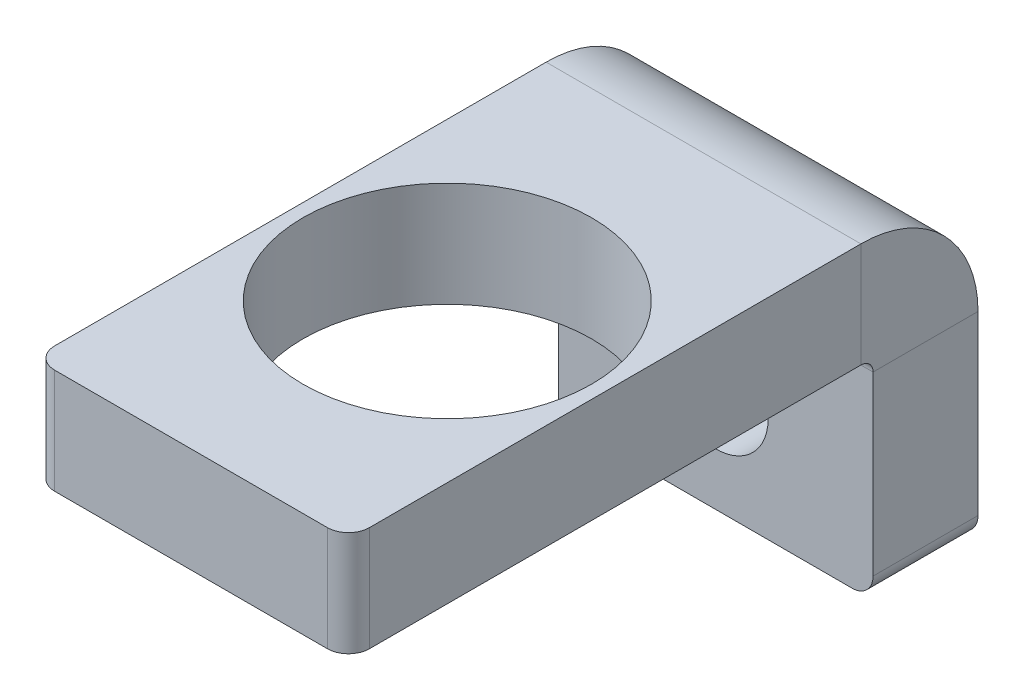
ISO-10303-21;
HEADER;
FILE_DESCRIPTION(('STEP AP214'),'2;1');
FILE_NAME('part.step','',(''),(''),'','','');
FILE_SCHEMA(('AUTOMOTIVE_DESIGN { 1 0 10303 214 1 1 1 1 }'));
ENDSEC;
DATA;
#1=APPLICATION_CONTEXT('core data for automotive mechanical design processes');
#2=APPLICATION_PROTOCOL_DEFINITION('international standard','automotive_design',2000,#1);
#3=PRODUCT_CONTEXT('',#1,'mechanical');
#4=PRODUCT('Part','Part','',(#3));
#5=PRODUCT_RELATED_PRODUCT_CATEGORY('part','',(#4));
#6=PRODUCT_DEFINITION_FORMATION('','',#4);
#7=PRODUCT_DEFINITION_CONTEXT('part definition',#1,'design');
#8=PRODUCT_DEFINITION('design','',#6,#7);
#9=PRODUCT_DEFINITION_SHAPE('','',#8);
#10=(LENGTH_UNIT() NAMED_UNIT(*) SI_UNIT(.MILLI.,.METRE.));
#11=(NAMED_UNIT(*) PLANE_ANGLE_UNIT() SI_UNIT($,.RADIAN.));
#12=(NAMED_UNIT(*) SI_UNIT($,.STERADIAN.) SOLID_ANGLE_UNIT());
#13=UNCERTAINTY_MEASURE_WITH_UNIT(LENGTH_MEASURE(1.E-05),#10,'distance_accuracy_value','');
#14=(GEOMETRIC_REPRESENTATION_CONTEXT(3) GLOBAL_UNCERTAINTY_ASSIGNED_CONTEXT((#13)) GLOBAL_UNIT_ASSIGNED_CONTEXT((#10,
#11,#12)) REPRESENTATION_CONTEXT('',''));
#15=CARTESIAN_POINT('',(0.,0.,0.));
#16=DIRECTION('',(0.,0.,1.));
#17=DIRECTION('',(1.,0.,0.));
#18=AXIS2_PLACEMENT_3D('',#15,#16,#17);
#19=CARTESIAN_POINT('',(-9.525,-9.525,-6.35));
#20=DIRECTION('',(-1.,0.,0.));
#21=DIRECTION('',(0.,0.,1.));
#22=AXIS2_PLACEMENT_3D('',#19,#20,#21);
#23=PLANE('',#22);
#24=DIRECTION('',(0.,-1.,0.));
#25=VECTOR('',#24,1.);
#26=CARTESIAN_POINT('',(-9.525,-9.525,-6.35));
#27=LINE('',#26,#25);
#28=CARTESIAN_POINT('',(-9.525,2.4384,-6.35));
#29=VERTEX_POINT('',#28);
#30=CARTESIAN_POINT('',(-9.525,-8.255,-6.35));
#31=VERTEX_POINT('',#30);
#32=EDGE_CURVE('E232',#29,#31,#27,.T.);
#33=ORIENTED_EDGE('',*,*,#32,.T.);
#34=DIRECTION('',(0.,0.,1.));
#35=VECTOR('',#34,1.);
#36=CARTESIAN_POINT('',(-9.525,-8.255,-6.35));
#37=LINE('',#36,#35);
#38=CARTESIAN_POINT('',(-9.525,-8.255,0.));
#39=VERTEX_POINT('',#38);
#40=EDGE_CURVE('E261',#31,#39,#37,.T.);
#41=ORIENTED_EDGE('',*,*,#40,.T.);
#42=DIRECTION('',(0.,-1.,0.));
#43=VECTOR('',#42,1.);
#44=CARTESIAN_POINT('',(-9.525,-9.525,0.));
#45=LINE('',#44,#43);
#46=CARTESIAN_POINT('',(-9.525,2.4384,0.));
#47=VERTEX_POINT('',#46);
#48=EDGE_CURVE('E240',#47,#39,#45,.T.);
#49=ORIENTED_EDGE('',*,*,#48,.F.);
#50=DIRECTION('',(0.,0.,-1.));
#51=VECTOR('',#50,1.);
#52=CARTESIAN_POINT('',(-9.525,2.4384,0.));
#53=LINE('',#52,#51);
#54=EDGE_CURVE('E211',#47,#29,#53,.T.);
#55=ORIENTED_EDGE('',*,*,#54,.T.);
#56=EDGE_LOOP('',(#33,#41,#49,#55));
#57=FACE_BOUND('',#56,.T.);
#58=ADVANCED_FACE('F65',(#57),#23,.T.);
#59=CARTESIAN_POINT('',(0.,0.,-6.35));
#60=DIRECTION('',(0.,0.,-1.));
#61=DIRECTION('',(-1.,0.,0.));
#62=AXIS2_PLACEMENT_3D('',#59,#60,#61);
#63=PLANE('',#62);
#64=CARTESIAN_POINT('',(0.,-3.175,-6.35));
#65=DIRECTION('',(0.,0.,1.));
#66=DIRECTION('',(1.,0.,0.));
#67=AXIS2_PLACEMENT_3D('',#64,#65,#66);
#68=CIRCLE('',#67,3.175);
#69=CARTESIAN_POINT('',(3.175,-3.175,-6.35));
#70=VERTEX_POINT('',#69);
#71=EDGE_CURVE('E224',#70,#70,#68,.T.);
#72=ORIENTED_EDGE('',*,*,#71,.T.);
#73=EDGE_LOOP('',(#72));
#74=FACE_BOUND('',#73,.T.);
#75=DIRECTION('',(1.,0.,0.));
#76=VECTOR('',#75,1.);
#77=CARTESIAN_POINT('',(-9.525,-9.525,-6.35));
#78=LINE('',#77,#76);
#79=CARTESIAN_POINT('',(-8.255,-9.525,-6.35));
#80=VERTEX_POINT('',#79);
#81=CARTESIAN_POINT('',(8.255,-9.525,-6.35));
#82=VERTEX_POINT('',#81);
#83=EDGE_CURVE('E236',#80,#82,#78,.T.);
#84=ORIENTED_EDGE('',*,*,#83,.F.);
#85=CARTESIAN_POINT('',(-8.255,-8.255,-6.35));
#86=DIRECTION('',(0.,0.,-1.));
#87=DIRECTION('',(-1.,0.,0.));
#88=AXIS2_PLACEMENT_3D('',#85,#86,#87);
#89=CIRCLE('',#88,1.27);
#90=EDGE_CURVE('E73',#80,#31,#89,.T.);
#91=ORIENTED_EDGE('',*,*,#90,.T.);
#92=ORIENTED_EDGE('',*,*,#32,.F.);
#93=DIRECTION('',(-1.,0.,0.));
#94=VECTOR('',#93,1.);
#95=CARTESIAN_POINT('',(-9.525,2.4384,-6.35));
#96=LINE('',#95,#94);
#97=CARTESIAN_POINT('',(9.525,2.4384,-6.35));
#98=VERTEX_POINT('',#97);
#99=EDGE_CURVE('E162',#29,#98,#96,.F.);
#100=ORIENTED_EDGE('',*,*,#99,.T.);
#101=DIRECTION('',(0.,1.,0.));
#102=VECTOR('',#101,1.);
#103=CARTESIAN_POINT('',(9.525,-9.525,-6.35));
#104=LINE('',#103,#102);
#105=CARTESIAN_POINT('',(9.525,-8.255,-6.35));
#106=VERTEX_POINT('',#105);
#107=EDGE_CURVE('E230',#106,#98,#104,.T.);
#108=ORIENTED_EDGE('',*,*,#107,.F.);
#109=CARTESIAN_POINT('',(8.255,-8.255,-6.35));
#110=DIRECTION('',(0.,0.,-1.));
#111=DIRECTION('',(-1.,0.,0.));
#112=AXIS2_PLACEMENT_3D('',#109,#110,#111);
#113=CIRCLE('',#112,1.27);
#114=EDGE_CURVE('E85',#106,#82,#113,.T.);
#115=ORIENTED_EDGE('',*,*,#114,.T.);
#116=EDGE_LOOP('',(#84,#91,#92,#100,#108,#115));
#117=FACE_BOUND('',#116,.T.);
#118=ADVANCED_FACE('F275',(#74,#117),#63,.T.);
#119=CARTESIAN_POINT('',(0.,0.,0.));
#120=DIRECTION('',(0.,0.,-1.));
#121=DIRECTION('',(-1.,0.,0.));
#122=AXIS2_PLACEMENT_3D('',#119,#120,#121);
#123=PLANE('',#122);
#124=CARTESIAN_POINT('',(0.,-3.175,0.));
#125=DIRECTION('',(0.,0.,1.));
#126=DIRECTION('',(1.,0.,0.));
#127=AXIS2_PLACEMENT_3D('',#124,#125,#126);
#128=CIRCLE('',#127,3.175);
#129=CARTESIAN_POINT('',(3.175,-3.175,0.));
#130=VERTEX_POINT('',#129);
#131=EDGE_CURVE('E222',#130,#130,#128,.T.);
#132=ORIENTED_EDGE('',*,*,#131,.F.);
#133=EDGE_LOOP('',(#132));
#134=FACE_BOUND('',#133,.T.);
#135=ORIENTED_EDGE('',*,*,#48,.T.);
#136=CARTESIAN_POINT('',(-8.255,-8.255,0.));
#137=DIRECTION('',(0.,0.,-1.));
#138=DIRECTION('',(-1.,0.,0.));
#139=AXIS2_PLACEMENT_3D('',#136,#137,#138);
#140=CIRCLE('',#139,1.27);
#141=CARTESIAN_POINT('',(-8.255,-9.525,0.));
#142=VERTEX_POINT('',#141);
#143=EDGE_CURVE('E266',#39,#142,#140,.F.);
#144=ORIENTED_EDGE('',*,*,#143,.T.);
#145=DIRECTION('',(1.,0.,0.));
#146=VECTOR('',#145,1.);
#147=CARTESIAN_POINT('',(-9.525,-9.525,0.));
#148=LINE('',#147,#146);
#149=CARTESIAN_POINT('',(8.255,-9.525,0.));
#150=VERTEX_POINT('',#149);
#151=EDGE_CURVE('E233',#142,#150,#148,.T.);
#152=ORIENTED_EDGE('',*,*,#151,.T.);
#153=CARTESIAN_POINT('',(8.255,-8.255,0.));
#154=DIRECTION('',(0.,0.,-1.));
#155=DIRECTION('',(-1.,0.,0.));
#156=AXIS2_PLACEMENT_3D('',#153,#154,#155);
#157=CIRCLE('',#156,1.27);
#158=CARTESIAN_POINT('',(9.525,-8.255,0.));
#159=VERTEX_POINT('',#158);
#160=EDGE_CURVE('E264',#150,#159,#157,.F.);
#161=ORIENTED_EDGE('',*,*,#160,.T.);
#162=DIRECTION('',(0.,1.,0.));
#163=VECTOR('',#162,1.);
#164=CARTESIAN_POINT('',(9.525,-9.525,0.));
#165=LINE('',#164,#163);
#166=CARTESIAN_POINT('',(9.525,2.4384,0.));
#167=VERTEX_POINT('',#166);
#168=EDGE_CURVE('E227',#159,#167,#165,.T.);
#169=ORIENTED_EDGE('',*,*,#168,.T.);
#170=DIRECTION('',(-1.,0.,0.));
#171=VECTOR('',#170,1.);
#172=CARTESIAN_POINT('',(-9.525,2.4384,0.));
#173=LINE('',#172,#171);
#174=EDGE_CURVE('E215',#47,#167,#173,.F.);
#175=ORIENTED_EDGE('',*,*,#174,.F.);
#176=EDGE_LOOP('',(#135,#144,#152,#161,#169,#175));
#177=FACE_BOUND('',#176,.T.);
#178=ADVANCED_FACE('F284',(#134,#177),#123,.F.);
#179=CARTESIAN_POINT('',(9.525,-9.525,-6.35));
#180=DIRECTION('',(1.,0.,0.));
#181=DIRECTION('',(0.,1.,0.));
#182=AXIS2_PLACEMENT_3D('',#179,#180,#181);
#183=PLANE('',#182);
#184=ORIENTED_EDGE('',*,*,#168,.F.);
#185=DIRECTION('',(0.,0.,1.));
#186=VECTOR('',#185,1.);
#187=CARTESIAN_POINT('',(9.525,-8.255,-6.35));
#188=LINE('',#187,#186);
#189=EDGE_CURVE('E13',#159,#106,#188,.F.);
#190=ORIENTED_EDGE('',*,*,#189,.T.);
#191=ORIENTED_EDGE('',*,*,#107,.T.);
#192=DIRECTION('',(0.,0.,-1.));
#193=VECTOR('',#192,1.);
#194=CARTESIAN_POINT('',(9.525,2.4384,0.));
#195=LINE('',#194,#193);
#196=EDGE_CURVE('E219',#167,#98,#195,.T.);
#197=ORIENTED_EDGE('',*,*,#196,.F.);
#198=EDGE_LOOP('',(#184,#190,#191,#197));
#199=FACE_BOUND('',#198,.T.);
#200=ADVANCED_FACE('F291',(#199),#183,.T.);
#201=CARTESIAN_POINT('',(-9.525,-9.525,-6.35));
#202=DIRECTION('',(0.,-1.,0.));
#203=DIRECTION('',(1.,0.,0.));
#204=AXIS2_PLACEMENT_3D('',#201,#202,#203);
#205=PLANE('',#204);
#206=ORIENTED_EDGE('',*,*,#151,.F.);
#207=DIRECTION('',(0.,0.,1.));
#208=VECTOR('',#207,1.);
#209=CARTESIAN_POINT('',(-8.255,-9.525,-6.35));
#210=LINE('',#209,#208);
#211=EDGE_CURVE('E271',#142,#80,#210,.F.);
#212=ORIENTED_EDGE('',*,*,#211,.T.);
#213=ORIENTED_EDGE('',*,*,#83,.T.);
#214=DIRECTION('',(0.,0.,1.));
#215=VECTOR('',#214,1.);
#216=CARTESIAN_POINT('',(8.255,-9.525,-6.35));
#217=LINE('',#216,#215);
#218=EDGE_CURVE('E268',#82,#150,#217,.T.);
#219=ORIENTED_EDGE('',*,*,#218,.T.);
#220=EDGE_LOOP('',(#206,#212,#213,#219));
#221=FACE_BOUND('',#220,.T.);
#222=ADVANCED_FACE('F287',(#221),#205,.T.);
#223=CARTESIAN_POINT('',(0.,-3.175,-6.35));
#224=DIRECTION('',(0.,0.,1.));
#225=DIRECTION('',(1.,0.,0.));
#226=AXIS2_PLACEMENT_3D('',#223,#224,#225);
#227=CYLINDRICAL_SURFACE('',#226,3.175);
#228=ORIENTED_EDGE('',*,*,#71,.F.);
#229=EDGE_LOOP('',(#228));
#230=FACE_BOUND('',#229,.T.);
#231=ORIENTED_EDGE('',*,*,#131,.T.);
#232=EDGE_LOOP('',(#231));
#233=FACE_BOUND('',#232,.T.);
#234=ADVANCED_FACE('F449',(#230,#233),#227,.F.);
#235=CARTESIAN_POINT('',(9.525,2.4384,0.7366));
#236=DIRECTION('',(1.,0.,0.));
#237=DIRECTION('',(0.,0.,-1.));
#238=AXIS2_PLACEMENT_3D('',#235,#236,#237);
#239=PLANE('',#238);
#240=DIRECTION('',(0.,-1.,0.));
#241=VECTOR('',#240,1.);
#242=CARTESIAN_POINT('',(9.525,9.525,0.736599999999975));
#243=LINE('',#242,#241);
#244=CARTESIAN_POINT('',(9.525,3.175,0.736599999999997));
#245=VERTEX_POINT('',#244);
#246=CARTESIAN_POINT('',(9.525,9.525,0.736599999999974));
#247=VERTEX_POINT('',#246);
#248=EDGE_CURVE('E205',#245,#247,#243,.F.);
#249=ORIENTED_EDGE('',*,*,#248,.F.);
#250=CARTESIAN_POINT('',(9.525,2.4384,0.7366));
#251=DIRECTION('',(-1.,0.,0.));
#252=DIRECTION('',(0.,0.,1.));
#253=AXIS2_PLACEMENT_3D('',#250,#251,#252);
#254=CIRCLE('',#253,0.7366);
#255=EDGE_CURVE('E165',#167,#245,#254,.F.);
#256=ORIENTED_EDGE('',*,*,#255,.F.);
#257=ORIENTED_EDGE('',*,*,#196,.T.);
#258=CARTESIAN_POINT('',(9.525,2.4384,0.7366));
#259=DIRECTION('',(-1.,0.,0.));
#260=DIRECTION('',(0.,0.,1.));
#261=AXIS2_PLACEMENT_3D('',#258,#259,#260);
#262=CIRCLE('',#261,7.0866);
#263=EDGE_CURVE('E210',#98,#247,#262,.F.);
#264=ORIENTED_EDGE('',*,*,#263,.T.);
#265=EDGE_LOOP('',(#249,#256,#257,#264));
#266=FACE_BOUND('',#265,.T.);
#267=ADVANCED_FACE('F295',(#266),#239,.T.);
#268=CARTESIAN_POINT('',(-9.525,2.4384,0.7366));
#269=DIRECTION('',(1.,0.,0.));
#270=DIRECTION('',(0.,0.,-1.));
#271=AXIS2_PLACEMENT_3D('',#268,#269,#270);
#272=PLANE('',#271);
#273=CARTESIAN_POINT('',(-9.525,2.4384,0.7366));
#274=DIRECTION('',(-1.,0.,0.));
#275=DIRECTION('',(0.,0.,1.));
#276=AXIS2_PLACEMENT_3D('',#273,#274,#275);
#277=CIRCLE('',#276,0.7366);
#278=CARTESIAN_POINT('',(-9.525,3.175,0.736599999999997));
#279=VERTEX_POINT('',#278);
#280=EDGE_CURVE('E172',#279,#47,#277,.T.);
#281=ORIENTED_EDGE('',*,*,#280,.F.);
#282=DIRECTION('',(0.,-1.,0.));
#283=VECTOR('',#282,1.);
#284=CARTESIAN_POINT('',(-9.525,3.175,0.736599999999997));
#285=LINE('',#284,#283);
#286=CARTESIAN_POINT('',(-9.525,9.525,0.736599999999975));
#287=VERTEX_POINT('',#286);
#288=EDGE_CURVE('E169',#279,#287,#285,.F.);
#289=ORIENTED_EDGE('',*,*,#288,.T.);
#290=CARTESIAN_POINT('',(-9.525,2.4384,0.7366));
#291=DIRECTION('',(-1.,0.,0.));
#292=DIRECTION('',(0.,0.,1.));
#293=AXIS2_PLACEMENT_3D('',#290,#291,#292);
#294=CIRCLE('',#293,7.0866);
#295=EDGE_CURVE('E154',#287,#29,#294,.T.);
#296=ORIENTED_EDGE('',*,*,#295,.T.);
#297=ORIENTED_EDGE('',*,*,#54,.F.);
#298=EDGE_LOOP('',(#281,#289,#296,#297));
#299=FACE_BOUND('',#298,.T.);
#300=ADVANCED_FACE('F170',(#299),#272,.F.);
#301=CARTESIAN_POINT('',(-9.525,2.4384,0.7366));
#302=DIRECTION('',(-1.,0.,0.));
#303=DIRECTION('',(0.,1.,0.));
#304=AXIS2_PLACEMENT_3D('',#301,#302,#303);
#305=CYLINDRICAL_SURFACE('',#304,7.0866);
#306=ORIENTED_EDGE('',*,*,#99,.F.);
#307=ORIENTED_EDGE('',*,*,#295,.F.);
#308=DIRECTION('',(-1.,0.,0.));
#309=VECTOR('',#308,1.);
#310=CARTESIAN_POINT('',(9.525,9.525,0.736599999999975));
#311=LINE('',#310,#309);
#312=EDGE_CURVE('E159',#287,#247,#311,.F.);
#313=ORIENTED_EDGE('',*,*,#312,.T.);
#314=ORIENTED_EDGE('',*,*,#263,.F.);
#315=EDGE_LOOP('',(#306,#307,#313,#314));
#316=FACE_BOUND('',#315,.T.);
#317=ADVANCED_FACE('F156',(#316),#305,.T.);
#318=CARTESIAN_POINT('',(-9.525,2.4384,0.7366));
#319=DIRECTION('',(-1.,0.,0.));
#320=DIRECTION('',(0.,1.,0.));
#321=AXIS2_PLACEMENT_3D('',#318,#319,#320);
#322=CYLINDRICAL_SURFACE('',#321,0.7366);
#323=ORIENTED_EDGE('',*,*,#174,.T.);
#324=ORIENTED_EDGE('',*,*,#255,.T.);
#325=DIRECTION('',(-1.,0.,0.));
#326=VECTOR('',#325,1.);
#327=CARTESIAN_POINT('',(9.525,3.175,0.736599999999997));
#328=LINE('',#327,#326);
#329=EDGE_CURVE('E177',#245,#279,#328,.T.);
#330=ORIENTED_EDGE('',*,*,#329,.T.);
#331=ORIENTED_EDGE('',*,*,#280,.T.);
#332=EDGE_LOOP('',(#323,#324,#330,#331));
#333=FACE_BOUND('',#332,.T.);
#334=ADVANCED_FACE('F298',(#333),#322,.F.);
#335=CARTESIAN_POINT('',(9.525,9.525,0.));
#336=DIRECTION('',(-1.,0.,0.));
#337=DIRECTION('',(0.,0.,1.));
#338=AXIS2_PLACEMENT_3D('',#335,#336,#337);
#339=PLANE('',#338);
#340=DIRECTION('',(0.,0.,-1.));
#341=VECTOR('',#340,1.);
#342=CARTESIAN_POINT('',(9.525,9.525,0.));
#343=LINE('',#342,#341);
#344=CARTESIAN_POINT('',(9.525,9.52500000000011,30.48));
#345=VERTEX_POINT('',#344);
#346=EDGE_CURVE('E186',#345,#247,#343,.T.);
#347=ORIENTED_EDGE('',*,*,#346,.F.);
#348=DIRECTION('',(0.,-1.,0.));
#349=VECTOR('',#348,1.);
#350=CARTESIAN_POINT('',(9.525,9.52500000000011,30.48));
#351=LINE('',#350,#349);
#352=CARTESIAN_POINT('',(9.525,3.17500000000011,30.48));
#353=VERTEX_POINT('',#352);
#354=EDGE_CURVE('E238',#345,#353,#351,.T.);
#355=ORIENTED_EDGE('',*,*,#354,.T.);
#356=DIRECTION('',(0.,0.,1.));
#357=VECTOR('',#356,1.);
#358=CARTESIAN_POINT('',(9.525,3.175,0.));
#359=LINE('',#358,#357);
#360=EDGE_CURVE('E187',#353,#245,#359,.F.);
#361=ORIENTED_EDGE('',*,*,#360,.T.);
#362=ORIENTED_EDGE('',*,*,#248,.T.);
#363=EDGE_LOOP('',(#347,#355,#361,#362));
#364=FACE_BOUND('',#363,.T.);
#365=ADVANCED_FACE('F315',(#364),#339,.F.);
#366=CARTESIAN_POINT('',(-9.525,9.52500000000011,31.75));
#367=DIRECTION('',(1.,0.,0.));
#368=DIRECTION('',(0.,0.,-1.));
#369=AXIS2_PLACEMENT_3D('',#366,#367,#368);
#370=PLANE('',#369);
#371=DIRECTION('',(0.,0.,-1.));
#372=VECTOR('',#371,1.);
#373=CARTESIAN_POINT('',(-9.525,3.17500000000011,31.75));
#374=LINE('',#373,#372);
#375=CARTESIAN_POINT('',(-9.525,3.17500000000011,30.48));
#376=VERTEX_POINT('',#375);
#377=EDGE_CURVE('E201',#279,#376,#374,.F.);
#378=ORIENTED_EDGE('',*,*,#377,.T.);
#379=DIRECTION('',(0.,-1.,0.));
#380=VECTOR('',#379,1.);
#381=CARTESIAN_POINT('',(-9.525,9.52500000000011,30.48));
#382=LINE('',#381,#380);
#383=CARTESIAN_POINT('',(-9.525,9.52500000000011,30.48));
#384=VERTEX_POINT('',#383);
#385=EDGE_CURVE('E191',#376,#384,#382,.F.);
#386=ORIENTED_EDGE('',*,*,#385,.T.);
#387=DIRECTION('',(0.,0.,1.));
#388=VECTOR('',#387,1.);
#389=CARTESIAN_POINT('',(-9.525,9.525,0.));
#390=LINE('',#389,#388);
#391=EDGE_CURVE('E183',#287,#384,#390,.T.);
#392=ORIENTED_EDGE('',*,*,#391,.F.);
#393=ORIENTED_EDGE('',*,*,#288,.F.);
#394=EDGE_LOOP('',(#378,#386,#392,#393));
#395=FACE_BOUND('',#394,.T.);
#396=ADVANCED_FACE('F189',(#395),#370,.F.);
#397=CARTESIAN_POINT('',(0.,9.525,0.));
#398=DIRECTION('',(0.,-1.,0.));
#399=DIRECTION('',(0.,0.,-1.));
#400=AXIS2_PLACEMENT_3D('',#397,#398,#399);
#401=PLANE('',#400);
#402=CARTESIAN_POINT('',(0.,9.52500000000019,16.2433));
#403=DIRECTION('',(0.,-1.,0.));
#404=DIRECTION('',(0.,0.,-1.));
#405=AXIS2_PLACEMENT_3D('',#402,#403,#404);
#406=CIRCLE('',#405,8.73125);
#407=CARTESIAN_POINT('',(0.,9.52500000000016,7.51205000000002));
#408=VERTEX_POINT('',#407);
#409=EDGE_CURVE('E208',#408,#408,#406,.T.);
#410=ORIENTED_EDGE('',*,*,#409,.T.);
#411=EDGE_LOOP('',(#410));
#412=FACE_BOUND('',#411,.T.);
#413=DIRECTION('',(1.,0.,0.));
#414=VECTOR('',#413,1.);
#415=CARTESIAN_POINT('',(0.,9.52500000000011,31.75));
#416=LINE('',#415,#414);
#417=CARTESIAN_POINT('',(-8.255,9.52500000000011,31.75));
#418=VERTEX_POINT('',#417);
#419=CARTESIAN_POINT('',(8.255,9.52500000000011,31.75));
#420=VERTEX_POINT('',#419);
#421=EDGE_CURVE('E192',#418,#420,#416,.T.);
#422=ORIENTED_EDGE('',*,*,#421,.T.);
#423=CARTESIAN_POINT('',(8.255,9.52500000000011,30.48));
#424=DIRECTION('',(0.,-1.,0.));
#425=DIRECTION('',(0.,0.,-1.));
#426=AXIS2_PLACEMENT_3D('',#423,#424,#425);
#427=CIRCLE('',#426,1.27);
#428=EDGE_CURVE('E258',#420,#345,#427,.F.);
#429=ORIENTED_EDGE('',*,*,#428,.T.);
#430=ORIENTED_EDGE('',*,*,#346,.T.);
#431=ORIENTED_EDGE('',*,*,#312,.F.);
#432=ORIENTED_EDGE('',*,*,#391,.T.);
#433=CARTESIAN_POINT('',(-8.255,9.52500000000011,30.48));
#434=DIRECTION('',(0.,-1.,0.));
#435=DIRECTION('',(0.,0.,-1.));
#436=AXIS2_PLACEMENT_3D('',#433,#434,#435);
#437=CIRCLE('',#436,1.27);
#438=EDGE_CURVE('E256',#384,#418,#437,.F.);
#439=ORIENTED_EDGE('',*,*,#438,.T.);
#440=EDGE_LOOP('',(#422,#429,#430,#431,#432,#439));
#441=FACE_BOUND('',#440,.T.);
#442=ADVANCED_FACE('F182',(#412,#441),#401,.F.);
#443=CARTESIAN_POINT('',(0.,3.175,0.));
#444=DIRECTION('',(0.,-1.,0.));
#445=DIRECTION('',(0.,0.,-1.));
#446=AXIS2_PLACEMENT_3D('',#443,#444,#445);
#447=PLANE('',#446);
#448=CARTESIAN_POINT('',(0.,3.17500000000006,16.2433));
#449=DIRECTION('',(0.,-1.,0.));
#450=DIRECTION('',(0.,0.,-1.));
#451=AXIS2_PLACEMENT_3D('',#448,#449,#450);
#452=CIRCLE('',#451,8.73125);
#453=CARTESIAN_POINT('',(0.,3.17500000000003,7.51205000000004));
#454=VERTEX_POINT('',#453);
#455=EDGE_CURVE('E519',#454,#454,#452,.T.);
#456=ORIENTED_EDGE('',*,*,#455,.F.);
#457=EDGE_LOOP('',(#456));
#458=FACE_BOUND('',#457,.T.);
#459=ORIENTED_EDGE('',*,*,#360,.F.);
#460=CARTESIAN_POINT('',(8.255,3.17500000000011,30.48));
#461=DIRECTION('',(0.,-1.,0.));
#462=DIRECTION('',(0.,0.,-1.));
#463=AXIS2_PLACEMENT_3D('',#460,#461,#462);
#464=CIRCLE('',#463,1.27);
#465=CARTESIAN_POINT('',(8.255,3.17500000000011,31.75));
#466=VERTEX_POINT('',#465);
#467=EDGE_CURVE('E249',#353,#466,#464,.T.);
#468=ORIENTED_EDGE('',*,*,#467,.T.);
#469=DIRECTION('',(-1.,0.,0.));
#470=VECTOR('',#469,1.);
#471=CARTESIAN_POINT('',(9.525,3.17500000000011,31.75));
#472=LINE('',#471,#470);
#473=CARTESIAN_POINT('',(-8.255,3.17500000000011,31.75));
#474=VERTEX_POINT('',#473);
#475=EDGE_CURVE('E195',#474,#466,#472,.F.);
#476=ORIENTED_EDGE('',*,*,#475,.F.);
#477=CARTESIAN_POINT('',(-8.255,3.17500000000011,30.48));
#478=DIRECTION('',(0.,-1.,0.));
#479=DIRECTION('',(0.,0.,-1.));
#480=AXIS2_PLACEMENT_3D('',#477,#478,#479);
#481=CIRCLE('',#480,1.27);
#482=EDGE_CURVE('E247',#474,#376,#481,.T.);
#483=ORIENTED_EDGE('',*,*,#482,.T.);
#484=ORIENTED_EDGE('',*,*,#377,.F.);
#485=ORIENTED_EDGE('',*,*,#329,.F.);
#486=EDGE_LOOP('',(#459,#468,#476,#483,#484,#485));
#487=FACE_BOUND('',#486,.T.);
#488=ADVANCED_FACE('F301',(#458,#487),#447,.T.);
#489=CARTESIAN_POINT('',(9.525,9.52500000000011,31.75));
#490=DIRECTION('',(0.,0.,-1.));
#491=DIRECTION('',(0.,1.,0.));
#492=AXIS2_PLACEMENT_3D('',#489,#490,#491);
#493=PLANE('',#492);
#494=ORIENTED_EDGE('',*,*,#475,.T.);
#495=DIRECTION('',(0.,-1.,0.));
#496=VECTOR('',#495,1.);
#497=CARTESIAN_POINT('',(8.255,9.52500000000011,31.75));
#498=LINE('',#497,#496);
#499=EDGE_CURVE('E254',#466,#420,#498,.F.);
#500=ORIENTED_EDGE('',*,*,#499,.T.);
#501=ORIENTED_EDGE('',*,*,#421,.F.);
#502=DIRECTION('',(0.,-1.,0.));
#503=VECTOR('',#502,1.);
#504=CARTESIAN_POINT('',(-8.255,9.52500000000011,31.75));
#505=LINE('',#504,#503);
#506=EDGE_CURVE('E251',#418,#474,#505,.T.);
#507=ORIENTED_EDGE('',*,*,#506,.T.);
#508=EDGE_LOOP('',(#494,#500,#501,#507));
#509=FACE_BOUND('',#508,.T.);
#510=ADVANCED_FACE('F309',(#509),#493,.F.);
#511=CARTESIAN_POINT('',(0.,9.52500000000019,16.2433));
#512=DIRECTION('',(0.,-1.,0.));
#513=DIRECTION('',(0.,0.,-1.));
#514=AXIS2_PLACEMENT_3D('',#511,#512,#513);
#515=CYLINDRICAL_SURFACE('',#514,8.73125);
#516=ORIENTED_EDGE('',*,*,#409,.F.);
#517=EDGE_LOOP('',(#516));
#518=FACE_BOUND('',#517,.T.);
#519=ORIENTED_EDGE('',*,*,#455,.T.);
#520=EDGE_LOOP('',(#519));
#521=FACE_BOUND('',#520,.T.);
#522=ADVANCED_FACE('F341',(#518,#521),#515,.F.);
#523=CARTESIAN_POINT('',(8.255,9.52500000000011,30.48));
#524=DIRECTION('',(0.,-1.,0.));
#525=DIRECTION('',(0.,0.,-1.));
#526=AXIS2_PLACEMENT_3D('',#523,#524,#525);
#527=CYLINDRICAL_SURFACE('',#526,1.27);
#528=ORIENTED_EDGE('',*,*,#428,.F.);
#529=ORIENTED_EDGE('',*,*,#499,.F.);
#530=ORIENTED_EDGE('',*,*,#467,.F.);
#531=ORIENTED_EDGE('',*,*,#354,.F.);
#532=EDGE_LOOP('',(#528,#529,#530,#531));
#533=FACE_BOUND('',#532,.T.);
#534=ADVANCED_FACE('F312',(#533),#527,.T.);
#535=CARTESIAN_POINT('',(-8.255,9.52500000000011,30.48));
#536=DIRECTION('',(0.,-1.,0.));
#537=DIRECTION('',(0.,0.,-1.));
#538=AXIS2_PLACEMENT_3D('',#535,#536,#537);
#539=CYLINDRICAL_SURFACE('',#538,1.27);
#540=ORIENTED_EDGE('',*,*,#438,.F.);
#541=ORIENTED_EDGE('',*,*,#385,.F.);
#542=ORIENTED_EDGE('',*,*,#482,.F.);
#543=ORIENTED_EDGE('',*,*,#506,.F.);
#544=EDGE_LOOP('',(#540,#541,#542,#543));
#545=FACE_BOUND('',#544,.T.);
#546=ADVANCED_FACE('F304',(#545),#539,.T.);
#547=CARTESIAN_POINT('',(-8.255,-8.255,-6.35));
#548=DIRECTION('',(0.,0.,1.));
#549=DIRECTION('',(1.,0.,0.));
#550=AXIS2_PLACEMENT_3D('',#547,#548,#549);
#551=CYLINDRICAL_SURFACE('',#550,1.27);
#552=ORIENTED_EDGE('',*,*,#90,.F.);
#553=ORIENTED_EDGE('',*,*,#211,.F.);
#554=ORIENTED_EDGE('',*,*,#143,.F.);
#555=ORIENTED_EDGE('',*,*,#40,.F.);
#556=EDGE_LOOP('',(#552,#553,#554,#555));
#557=FACE_BOUND('',#556,.T.);
#558=ADVANCED_FACE('F281',(#557),#551,.T.);
#559=CARTESIAN_POINT('',(8.255,-8.255,-6.35));
#560=DIRECTION('',(0.,0.,1.));
#561=DIRECTION('',(1.,0.,0.));
#562=AXIS2_PLACEMENT_3D('',#559,#560,#561);
#563=CYLINDRICAL_SURFACE('',#562,1.27);
#564=ORIENTED_EDGE('',*,*,#114,.F.);
#565=ORIENTED_EDGE('',*,*,#189,.F.);
#566=ORIENTED_EDGE('',*,*,#160,.F.);
#567=ORIENTED_EDGE('',*,*,#218,.F.);
#568=EDGE_LOOP('',(#564,#565,#566,#567));
#569=FACE_BOUND('',#568,.T.);
#570=ADVANCED_FACE('F67',(#569),#563,.T.);
#571=CLOSED_SHELL('',(#58,#118,#178,#200,#222,#234,#267,#300,#317,#334,#365,#396,#442,#488,#510,
#522,#534,#546,#558,#570));
#572=MANIFOLD_SOLID_BREP('B2',#571);
#573=ADVANCED_BREP_SHAPE_REPRESENTATION('',(#18,#572),#14);
#574=SHAPE_DEFINITION_REPRESENTATION(#9,#573);
ENDSEC;
END-ISO-10303-21;
